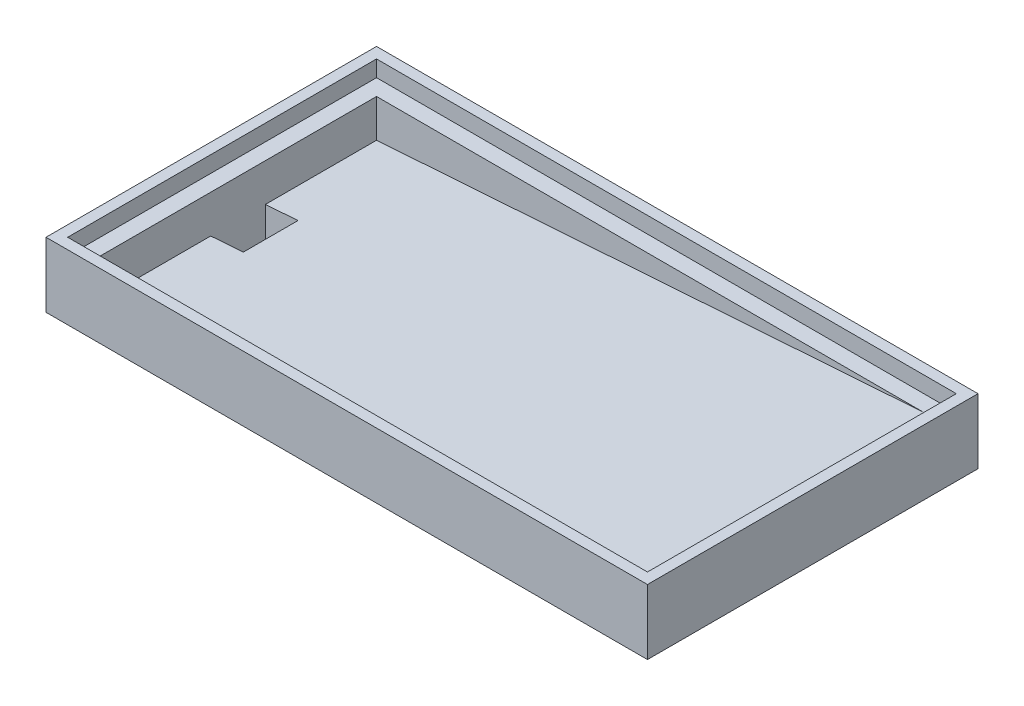
ISO-10303-21;
HEADER;
FILE_DESCRIPTION(('STEP AP214'),'2;1');
FILE_NAME('part.step','',(''),(''),'','','');
FILE_SCHEMA(('AUTOMOTIVE_DESIGN { 1 0 10303 214 1 1 1 1 }'));
ENDSEC;
DATA;
#1=APPLICATION_CONTEXT('core data for automotive mechanical design processes');
#2=APPLICATION_PROTOCOL_DEFINITION('international standard','automotive_design',2000,#1);
#3=PRODUCT_CONTEXT('',#1,'mechanical');
#4=PRODUCT('Part','Part','',(#3));
#5=PRODUCT_RELATED_PRODUCT_CATEGORY('part','',(#4));
#6=PRODUCT_DEFINITION_FORMATION('','',#4);
#7=PRODUCT_DEFINITION_CONTEXT('part definition',#1,'design');
#8=PRODUCT_DEFINITION('design','',#6,#7);
#9=PRODUCT_DEFINITION_SHAPE('','',#8);
#10=(LENGTH_UNIT() NAMED_UNIT(*) SI_UNIT(.MILLI.,.METRE.));
#11=(NAMED_UNIT(*) PLANE_ANGLE_UNIT() SI_UNIT($,.RADIAN.));
#12=(NAMED_UNIT(*) SI_UNIT($,.STERADIAN.) SOLID_ANGLE_UNIT());
#13=UNCERTAINTY_MEASURE_WITH_UNIT(LENGTH_MEASURE(1.E-05),#10,'distance_accuracy_value','');
#14=(GEOMETRIC_REPRESENTATION_CONTEXT(3) GLOBAL_UNCERTAINTY_ASSIGNED_CONTEXT((#13)) GLOBAL_UNIT_ASSIGNED_CONTEXT((#10,
#11,#12)) REPRESENTATION_CONTEXT('',''));
#15=CARTESIAN_POINT('',(0.,0.,0.));
#16=DIRECTION('',(0.,0.,1.));
#17=DIRECTION('',(1.,0.,0.));
#18=AXIS2_PLACEMENT_3D('',#15,#16,#17);
#19=CARTESIAN_POINT('',(0.,-20.,-23.4));
#20=DIRECTION('',(0.,0.,1.));
#21=DIRECTION('',(1.,0.,0.));
#22=AXIS2_PLACEMENT_3D('',#19,#20,#21);
#23=PLANE('',#22);
#24=DIRECTION('',(1.,0.,0.));
#25=VECTOR('',#24,1.);
#26=CARTESIAN_POINT('',(0.,-20.,-23.4));
#27=LINE('',#26,#25);
#28=CARTESIAN_POINT('',(3.00000000000001,-20.,-23.4));
#29=VERTEX_POINT('',#28);
#30=CARTESIAN_POINT('',(27.9998333328704,-20.,-23.4));
#31=VERTEX_POINT('',#30);
#32=EDGE_CURVE('E266',#29,#31,#27,.T.);
#33=ORIENTED_EDGE('',*,*,#32,.F.);
#34=DIRECTION('',(0.,-1.,0.));
#35=VECTOR('',#34,1.);
#36=CARTESIAN_POINT('',(3.00000000000001,-2.,-23.4));
#37=LINE('',#36,#35);
#38=CARTESIAN_POINT('',(2.99999999999999,-10.,-23.4));
#39=VERTEX_POINT('',#38);
#40=EDGE_CURVE('E248',#39,#29,#37,.T.);
#41=ORIENTED_EDGE('',*,*,#40,.F.);
#42=DIRECTION('',(-0.997606892616086,-0.0691410717654713,0.));
#43=VECTOR('',#42,1.);
#44=CARTESIAN_POINT('',(104.,-3.,-23.4));
#45=LINE('',#44,#43);
#46=CARTESIAN_POINT('',(9.00000000000001,-9.58415841584159,-23.4));
#47=VERTEX_POINT('',#46);
#48=EDGE_CURVE('E12',#47,#39,#45,.T.);
#49=ORIENTED_EDGE('',*,*,#48,.F.);
#50=DIRECTION('',(0.,-1.,0.));
#51=VECTOR('',#50,1.);
#52=CARTESIAN_POINT('',(9.00000000000001,-2.,-23.4));
#53=LINE('',#52,#51);
#54=CARTESIAN_POINT('',(9.00000000000001,-12.,-23.4));
#55=VERTEX_POINT('',#54);
#56=EDGE_CURVE('E403',#47,#55,#53,.T.);
#57=ORIENTED_EDGE('',*,*,#56,.T.);
#58=DIRECTION('',(1.,0.,0.));
#59=VECTOR('',#58,1.);
#60=CARTESIAN_POINT('',(0.,-12.,-23.4));
#61=LINE('',#60,#59);
#62=CARTESIAN_POINT('',(27.9998333328704,-12.,-23.4));
#63=VERTEX_POINT('',#62);
#64=EDGE_CURVE('E279',#55,#63,#61,.T.);
#65=ORIENTED_EDGE('',*,*,#64,.T.);
#66=DIRECTION('',(0.,1.,0.));
#67=VECTOR('',#66,1.);
#68=CARTESIAN_POINT('',(27.9998333328704,-20.,-23.4));
#69=LINE('',#68,#67);
#70=EDGE_CURVE('E307',#31,#63,#69,.T.);
#71=ORIENTED_EDGE('',*,*,#70,.F.);
#72=EDGE_LOOP('',(#33,#41,#49,#57,#65,#71));
#73=FACE_BOUND('',#72,.T.);
#74=ADVANCED_FACE('F89',(#73),#23,.F.);
#75=CARTESIAN_POINT('',(0.,-20.,-33.5));
#76=DIRECTION('',(0.,0.,1.));
#77=DIRECTION('',(1.,0.,0.));
#78=AXIS2_PLACEMENT_3D('',#75,#76,#77);
#79=PLANE('',#78);
#80=DIRECTION('',(0.,-1.,0.));
#81=VECTOR('',#80,1.);
#82=CARTESIAN_POINT('',(3.00000000000001,-2.,-33.5));
#83=LINE('',#82,#81);
#84=CARTESIAN_POINT('',(2.99999999999999,-10.,-33.5));
#85=VERTEX_POINT('',#84);
#86=CARTESIAN_POINT('',(3.00000000000001,-20.,-33.5));
#87=VERTEX_POINT('',#86);
#88=EDGE_CURVE('E230',#85,#87,#83,.T.);
#89=ORIENTED_EDGE('',*,*,#88,.T.);
#90=DIRECTION('',(1.,0.,0.));
#91=VECTOR('',#90,1.);
#92=CARTESIAN_POINT('',(0.,-20.,-33.5));
#93=LINE('',#92,#91);
#94=CARTESIAN_POINT('',(27.9998333328704,-20.,-33.5));
#95=VERTEX_POINT('',#94);
#96=EDGE_CURVE('E235',#87,#95,#93,.T.);
#97=ORIENTED_EDGE('',*,*,#96,.T.);
#98=DIRECTION('',(0.,1.,0.));
#99=VECTOR('',#98,1.);
#100=CARTESIAN_POINT('',(27.9998333328704,-20.,-33.5));
#101=LINE('',#100,#99);
#102=CARTESIAN_POINT('',(27.9998333328704,-12.,-33.5));
#103=VERTEX_POINT('',#102);
#104=EDGE_CURVE('E278',#95,#103,#101,.T.);
#105=ORIENTED_EDGE('',*,*,#104,.T.);
#106=DIRECTION('',(1.,0.,0.));
#107=VECTOR('',#106,1.);
#108=CARTESIAN_POINT('',(0.,-12.,-33.5));
#109=LINE('',#108,#107);
#110=CARTESIAN_POINT('',(9.00000000000001,-12.,-33.5));
#111=VERTEX_POINT('',#110);
#112=EDGE_CURVE('E287',#111,#103,#109,.T.);
#113=ORIENTED_EDGE('',*,*,#112,.F.);
#114=DIRECTION('',(0.,-1.,0.));
#115=VECTOR('',#114,1.);
#116=CARTESIAN_POINT('',(9.00000000000001,-2.,-33.5));
#117=LINE('',#116,#115);
#118=CARTESIAN_POINT('',(9.00000000000002,-9.58415841584158,-33.5));
#119=VERTEX_POINT('',#118);
#120=EDGE_CURVE('E105',#119,#111,#117,.T.);
#121=ORIENTED_EDGE('',*,*,#120,.F.);
#122=DIRECTION('',(0.997606892616086,0.0691410717654713,0.));
#123=VECTOR('',#122,1.);
#124=CARTESIAN_POINT('',(104.,-3.,-33.5000000000001));
#125=LINE('',#124,#123);
#126=EDGE_CURVE('E238',#85,#119,#125,.T.);
#127=ORIENTED_EDGE('',*,*,#126,.F.);
#128=EDGE_LOOP('',(#89,#97,#105,#113,#121,#127));
#129=FACE_BOUND('',#128,.T.);
#130=ADVANCED_FACE('F232',(#129),#79,.T.);
#131=CARTESIAN_POINT('',(0.,-12.,0.));
#132=DIRECTION('',(0.,1.,0.));
#133=DIRECTION('',(0.,0.,1.));
#134=AXIS2_PLACEMENT_3D('',#131,#132,#133);
#135=PLANE('',#134);
#136=DIRECTION('',(0.,0.,1.));
#137=VECTOR('',#136,1.);
#138=CARTESIAN_POINT('',(9.00000000000001,-12.,-33.5));
#139=LINE('',#138,#137);
#140=EDGE_CURVE('E242',#111,#55,#139,.T.);
#141=ORIENTED_EDGE('',*,*,#140,.F.);
#142=ORIENTED_EDGE('',*,*,#112,.T.);
#143=DIRECTION('',(0.,0.,-1.));
#144=VECTOR('',#143,1.);
#145=CARTESIAN_POINT('',(27.9998333328704,-12.,0.));
#146=LINE('',#145,#144);
#147=EDGE_CURVE('E282',#63,#103,#146,.T.);
#148=ORIENTED_EDGE('',*,*,#147,.F.);
#149=ORIENTED_EDGE('',*,*,#64,.F.);
#150=EDGE_LOOP('',(#141,#142,#148,#149));
#151=FACE_BOUND('',#150,.T.);
#152=ADVANCED_FACE('F462',(#151),#135,.F.);
#153=CARTESIAN_POINT('',(104.,-20.002,-54.));
#154=DIRECTION('',(0.,0.,-1.));
#155=DIRECTION('',(-1.,0.,0.));
#156=AXIS2_PLACEMENT_3D('',#153,#154,#155);
#157=PLANE('',#156);
#158=DIRECTION('',(0.997606892616086,0.0691410717654713,0.));
#159=VECTOR('',#158,1.);
#160=CARTESIAN_POINT('',(104.,-3.,-54.));
#161=LINE('',#160,#159);
#162=CARTESIAN_POINT('',(3.,-10.,-54.));
#163=VERTEX_POINT('',#162);
#164=CARTESIAN_POINT('',(104.,-3.,-54.));
#165=VERTEX_POINT('',#164);
#166=EDGE_CURVE('E417',#163,#165,#161,.T.);
#167=ORIENTED_EDGE('',*,*,#166,.T.);
#168=DIRECTION('',(-1.,0.,0.));
#169=VECTOR('',#168,1.);
#170=CARTESIAN_POINT('',(104.,-3.,-54.));
#171=LINE('',#170,#169);
#172=CARTESIAN_POINT('',(3.,-3.,-54.));
#173=VERTEX_POINT('',#172);
#174=EDGE_CURVE('E426',#165,#173,#171,.T.);
#175=ORIENTED_EDGE('',*,*,#174,.T.);
#176=DIRECTION('',(0.,1.,0.));
#177=VECTOR('',#176,1.);
#178=CARTESIAN_POINT('',(3.,-20.002,-54.));
#179=LINE('',#178,#177);
#180=EDGE_CURVE('E437',#163,#173,#179,.T.);
#181=ORIENTED_EDGE('',*,*,#180,.F.);
#182=EDGE_LOOP('',(#167,#175,#181));
#183=FACE_BOUND('',#182,.T.);
#184=ADVANCED_FACE('F465',(#183),#157,.F.);
#185=CARTESIAN_POINT('',(3.00000000000001,-20.002,-3.));
#186=DIRECTION('',(0.,0.,1.));
#187=DIRECTION('',(1.,0.,0.));
#188=AXIS2_PLACEMENT_3D('',#185,#186,#187);
#189=PLANE('',#188);
#190=DIRECTION('',(0.997606892616085,0.0691410717654713,0.));
#191=VECTOR('',#190,1.);
#192=CARTESIAN_POINT('',(104.,-3.,-3.00000000000001));
#193=LINE('',#192,#191);
#194=CARTESIAN_POINT('',(3.00000000000001,-10.,-3.));
#195=VERTEX_POINT('',#194);
#196=CARTESIAN_POINT('',(104.,-3.,-3.00000000000001));
#197=VERTEX_POINT('',#196);
#198=EDGE_CURVE('E410',#195,#197,#193,.T.);
#199=ORIENTED_EDGE('',*,*,#198,.F.);
#200=DIRECTION('',(0.,1.,0.));
#201=VECTOR('',#200,1.);
#202=CARTESIAN_POINT('',(3.00000000000001,-20.002,-3.));
#203=LINE('',#202,#201);
#204=CARTESIAN_POINT('',(3.00000000000001,-3.,-3.));
#205=VERTEX_POINT('',#204);
#206=EDGE_CURVE('E448',#195,#205,#203,.T.);
#207=ORIENTED_EDGE('',*,*,#206,.T.);
#208=DIRECTION('',(1.,0.,0.));
#209=VECTOR('',#208,1.);
#210=CARTESIAN_POINT('',(3.00000000000001,-3.,-3.));
#211=LINE('',#210,#209);
#212=EDGE_CURVE('E425',#205,#197,#211,.T.);
#213=ORIENTED_EDGE('',*,*,#212,.T.);
#214=EDGE_LOOP('',(#199,#207,#213));
#215=FACE_BOUND('',#214,.T.);
#216=ADVANCED_FACE('F473',(#215),#189,.F.);
#217=DIRECTION('',(1.,0.,0.));
#218=VECTOR('',#217,1.);
#219=CARTESIAN_POINT('',(0.,-12.,-43.5));
#220=LINE('',#219,#218);
#221=CARTESIAN_POINT('',(-2.00000000000001,-12.,-43.5));
#222=VERTEX_POINT('',#221);
#223=CARTESIAN_POINT('',(37.9998333328704,-12.,-43.5));
#224=VERTEX_POINT('',#223);
#225=EDGE_CURVE('E298',#222,#224,#220,.T.);
#226=ORIENTED_EDGE('',*,*,#225,.F.);
#227=DIRECTION('',(0.,0.,-1.));
#228=VECTOR('',#227,1.);
#229=CARTESIAN_POINT('',(-2.00000000000001,-12.,-59.));
#230=LINE('',#229,#228);
#231=CARTESIAN_POINT('',(-2.00000000000001,-12.,-59.));
#232=VERTEX_POINT('',#231);
#233=EDGE_CURVE('E332',#222,#232,#230,.T.);
#234=ORIENTED_EDGE('',*,*,#233,.T.);
#235=DIRECTION('',(1.,0.,0.));
#236=VECTOR('',#235,1.);
#237=CARTESIAN_POINT('',(109.,-12.,-59.));
#238=LINE('',#237,#236);
#239=CARTESIAN_POINT('',(109.,-12.,-59.));
#240=VERTEX_POINT('',#239);
#241=EDGE_CURVE('E336',#232,#240,#238,.T.);
#242=ORIENTED_EDGE('',*,*,#241,.T.);
#243=DIRECTION('',(0.,0.,1.));
#244=VECTOR('',#243,1.);
#245=CARTESIAN_POINT('',(109.,-12.,2.));
#246=LINE('',#245,#244);
#247=CARTESIAN_POINT('',(109.,-12.,2.));
#248=VERTEX_POINT('',#247);
#249=EDGE_CURVE('E319',#240,#248,#246,.T.);
#250=ORIENTED_EDGE('',*,*,#249,.T.);
#251=DIRECTION('',(-1.,0.,0.));
#252=VECTOR('',#251,1.);
#253=CARTESIAN_POINT('',(-2.,-12.,2.));
#254=LINE('',#253,#252);
#255=CARTESIAN_POINT('',(-2.,-12.,2.));
#256=VERTEX_POINT('',#255);
#257=EDGE_CURVE('E328',#248,#256,#254,.T.);
#258=ORIENTED_EDGE('',*,*,#257,.T.);
#259=CARTESIAN_POINT('',(-2.,-12.,-13.5));
#260=VERTEX_POINT('',#259);
#261=EDGE_CURVE('E333',#256,#260,#230,.T.);
#262=ORIENTED_EDGE('',*,*,#261,.T.);
#263=DIRECTION('',(-1.,0.,0.));
#264=VECTOR('',#263,1.);
#265=CARTESIAN_POINT('',(0.,-12.,-13.5));
#266=LINE('',#265,#264);
#267=CARTESIAN_POINT('',(37.9998333328704,-12.,-13.5));
#268=VERTEX_POINT('',#267);
#269=EDGE_CURVE('E294',#268,#260,#266,.T.);
#270=ORIENTED_EDGE('',*,*,#269,.F.);
#271=DIRECTION('',(0.,0.,1.));
#272=VECTOR('',#271,1.);
#273=CARTESIAN_POINT('',(37.9998333328704,-12.,0.));
#274=LINE('',#273,#272);
#275=EDGE_CURVE('E290',#224,#268,#274,.T.);
#276=ORIENTED_EDGE('',*,*,#275,.F.);
#277=EDGE_LOOP('',(#226,#234,#242,#250,#258,#262,#270,#276));
#278=FACE_BOUND('',#277,.T.);
#279=ADVANCED_FACE('F467',(#278),#135,.F.);
#280=CARTESIAN_POINT('',(-2.,-10.,0.));
#281=DIRECTION('',(-1.,0.,0.));
#282=DIRECTION('',(0.,0.,1.));
#283=AXIS2_PLACEMENT_3D('',#280,#281,#282);
#284=PLANE('',#283);
#285=DIRECTION('',(0.,0.,1.));
#286=VECTOR('',#285,1.);
#287=CARTESIAN_POINT('',(-2.,0.,0.));
#288=LINE('',#287,#286);
#289=CARTESIAN_POINT('',(-2.00000000000001,0.,-59.));
#290=VERTEX_POINT('',#289);
#291=CARTESIAN_POINT('',(-2.,0.,2.));
#292=VERTEX_POINT('',#291);
#293=EDGE_CURVE('E360',#290,#292,#288,.T.);
#294=ORIENTED_EDGE('',*,*,#293,.F.);
#295=DIRECTION('',(0.,1.,0.));
#296=VECTOR('',#295,1.);
#297=CARTESIAN_POINT('',(-2.00000000000001,-10.,-59.));
#298=LINE('',#297,#296);
#299=EDGE_CURVE('E385',#232,#290,#298,.T.);
#300=ORIENTED_EDGE('',*,*,#299,.F.);
#301=ORIENTED_EDGE('',*,*,#233,.F.);
#302=DIRECTION('',(0.,1.,0.));
#303=VECTOR('',#302,1.);
#304=CARTESIAN_POINT('',(-2.00000000000001,-20.,-43.5));
#305=LINE('',#304,#303);
#306=CARTESIAN_POINT('',(-2.00000000000001,-20.,-43.5));
#307=VERTEX_POINT('',#306);
#308=EDGE_CURVE('E306',#307,#222,#305,.T.);
#309=ORIENTED_EDGE('',*,*,#308,.F.);
#310=DIRECTION('',(0.,0.,-1.));
#311=VECTOR('',#310,1.);
#312=CARTESIAN_POINT('',(-2.,-20.,0.));
#313=LINE('',#312,#311);
#314=CARTESIAN_POINT('',(-2.,-20.,-13.5));
#315=VERTEX_POINT('',#314);
#316=EDGE_CURVE('E272',#315,#307,#313,.T.);
#317=ORIENTED_EDGE('',*,*,#316,.F.);
#318=DIRECTION('',(0.,1.,0.));
#319=VECTOR('',#318,1.);
#320=CARTESIAN_POINT('',(-2.,-20.,-13.5));
#321=LINE('',#320,#319);
#322=EDGE_CURVE('E311',#315,#260,#321,.T.);
#323=ORIENTED_EDGE('',*,*,#322,.T.);
#324=ORIENTED_EDGE('',*,*,#261,.F.);
#325=DIRECTION('',(0.,1.,0.));
#326=VECTOR('',#325,1.);
#327=CARTESIAN_POINT('',(-2.,-10.,2.));
#328=LINE('',#327,#326);
#329=EDGE_CURVE('E384',#256,#292,#328,.T.);
#330=ORIENTED_EDGE('',*,*,#329,.T.);
#331=EDGE_LOOP('',(#294,#300,#301,#309,#317,#323,#324,#330));
#332=FACE_BOUND('',#331,.T.);
#333=ADVANCED_FACE('F91',(#332),#284,.T.);
#334=CARTESIAN_POINT('',(0.,-10.,-59.));
#335=DIRECTION('',(0.,0.,-1.));
#336=DIRECTION('',(-1.,0.,0.));
#337=AXIS2_PLACEMENT_3D('',#334,#335,#336);
#338=PLANE('',#337);
#339=DIRECTION('',(-1.,0.,0.));
#340=VECTOR('',#339,1.);
#341=CARTESIAN_POINT('',(0.,0.,-59.));
#342=LINE('',#341,#340);
#343=CARTESIAN_POINT('',(109.,0.,-59.));
#344=VERTEX_POINT('',#343);
#345=EDGE_CURVE('E380',#344,#290,#342,.T.);
#346=ORIENTED_EDGE('',*,*,#345,.F.);
#347=DIRECTION('',(0.,1.,0.));
#348=VECTOR('',#347,1.);
#349=CARTESIAN_POINT('',(109.,-10.,-59.));
#350=LINE('',#349,#348);
#351=EDGE_CURVE('E388',#240,#344,#350,.T.);
#352=ORIENTED_EDGE('',*,*,#351,.F.);
#353=ORIENTED_EDGE('',*,*,#241,.F.);
#354=ORIENTED_EDGE('',*,*,#299,.T.);
#355=EDGE_LOOP('',(#346,#352,#353,#354));
#356=FACE_BOUND('',#355,.T.);
#357=ADVANCED_FACE('F555',(#356),#338,.T.);
#358=CARTESIAN_POINT('',(109.,-10.,0.));
#359=DIRECTION('',(1.,0.,0.));
#360=DIRECTION('',(0.,0.,-1.));
#361=AXIS2_PLACEMENT_3D('',#358,#359,#360);
#362=PLANE('',#361);
#363=DIRECTION('',(0.,0.,-1.));
#364=VECTOR('',#363,1.);
#365=CARTESIAN_POINT('',(109.,0.,0.));
#366=LINE('',#365,#364);
#367=CARTESIAN_POINT('',(109.,0.,2.));
#368=VERTEX_POINT('',#367);
#369=EDGE_CURVE('E376',#368,#344,#366,.T.);
#370=ORIENTED_EDGE('',*,*,#369,.F.);
#371=DIRECTION('',(0.,1.,0.));
#372=VECTOR('',#371,1.);
#373=CARTESIAN_POINT('',(109.,-10.,2.));
#374=LINE('',#373,#372);
#375=EDGE_CURVE('E391',#248,#368,#374,.T.);
#376=ORIENTED_EDGE('',*,*,#375,.F.);
#377=ORIENTED_EDGE('',*,*,#249,.F.);
#378=ORIENTED_EDGE('',*,*,#351,.T.);
#379=EDGE_LOOP('',(#370,#376,#377,#378));
#380=FACE_BOUND('',#379,.T.);
#381=ADVANCED_FACE('F667',(#380),#362,.T.);
#382=CARTESIAN_POINT('',(0.,-10.,2.));
#383=DIRECTION('',(0.,0.,1.));
#384=DIRECTION('',(1.,0.,0.));
#385=AXIS2_PLACEMENT_3D('',#382,#383,#384);
#386=PLANE('',#385);
#387=DIRECTION('',(1.,0.,0.));
#388=VECTOR('',#387,1.);
#389=CARTESIAN_POINT('',(0.,0.,2.));
#390=LINE('',#389,#388);
#391=EDGE_CURVE('E372',#292,#368,#390,.T.);
#392=ORIENTED_EDGE('',*,*,#391,.F.);
#393=ORIENTED_EDGE('',*,*,#329,.F.);
#394=ORIENTED_EDGE('',*,*,#257,.F.);
#395=ORIENTED_EDGE('',*,*,#375,.T.);
#396=EDGE_LOOP('',(#392,#393,#394,#395));
#397=FACE_BOUND('',#396,.T.);
#398=ADVANCED_FACE('F659',(#397),#386,.T.);
#399=CARTESIAN_POINT('',(0.,0.,0.));
#400=DIRECTION('',(0.,1.,0.));
#401=DIRECTION('',(0.,0.,1.));
#402=AXIS2_PLACEMENT_3D('',#399,#400,#401);
#403=PLANE('',#402);
#404=DIRECTION('',(0.,0.,1.));
#405=VECTOR('',#404,1.);
#406=CARTESIAN_POINT('',(0.,0.,0.));
#407=LINE('',#406,#405);
#408=CARTESIAN_POINT('',(0.,0.,-57.));
#409=VERTEX_POINT('',#408);
#410=CARTESIAN_POINT('',(0.,0.,0.));
#411=VERTEX_POINT('',#410);
#412=EDGE_CURVE('E340',#409,#411,#407,.T.);
#413=ORIENTED_EDGE('',*,*,#412,.F.);
#414=DIRECTION('',(-1.,0.,0.));
#415=VECTOR('',#414,1.);
#416=CARTESIAN_POINT('',(0.,0.,-57.));
#417=LINE('',#416,#415);
#418=CARTESIAN_POINT('',(107.,0.,-57.));
#419=VERTEX_POINT('',#418);
#420=EDGE_CURVE('E352',#419,#409,#417,.T.);
#421=ORIENTED_EDGE('',*,*,#420,.F.);
#422=DIRECTION('',(0.,0.,-1.));
#423=VECTOR('',#422,1.);
#424=CARTESIAN_POINT('',(107.,0.,0.));
#425=LINE('',#424,#423);
#426=CARTESIAN_POINT('',(107.,0.,0.));
#427=VERTEX_POINT('',#426);
#428=EDGE_CURVE('E348',#427,#419,#425,.T.);
#429=ORIENTED_EDGE('',*,*,#428,.F.);
#430=DIRECTION('',(1.,0.,0.));
#431=VECTOR('',#430,1.);
#432=CARTESIAN_POINT('',(0.,0.,0.));
#433=LINE('',#432,#431);
#434=EDGE_CURVE('E344',#411,#427,#433,.T.);
#435=ORIENTED_EDGE('',*,*,#434,.F.);
#436=EDGE_LOOP('',(#413,#421,#429,#435));
#437=FACE_BOUND('',#436,.T.);
#438=ORIENTED_EDGE('',*,*,#293,.T.);
#439=ORIENTED_EDGE('',*,*,#391,.T.);
#440=ORIENTED_EDGE('',*,*,#369,.T.);
#441=ORIENTED_EDGE('',*,*,#345,.T.);
#442=EDGE_LOOP('',(#438,#439,#440,#441));
#443=FACE_BOUND('',#442,.T.);
#444=ADVANCED_FACE('F649',(#437,#443),#403,.T.);
#445=CARTESIAN_POINT('',(0.,-10.,0.));
#446=DIRECTION('',(-1.,0.,0.));
#447=DIRECTION('',(0.,0.,1.));
#448=AXIS2_PLACEMENT_3D('',#445,#446,#447);
#449=PLANE('',#448);
#450=DIRECTION('',(0.,1.,0.));
#451=VECTOR('',#450,1.);
#452=CARTESIAN_POINT('',(0.,-10.,0.));
#453=LINE('',#452,#451);
#454=CARTESIAN_POINT('',(0.,-3.,0.));
#455=VERTEX_POINT('',#454);
#456=EDGE_CURVE('E356',#455,#411,#453,.T.);
#457=ORIENTED_EDGE('',*,*,#456,.F.);
#458=DIRECTION('',(0.,0.,1.));
#459=VECTOR('',#458,1.);
#460=CARTESIAN_POINT('',(0.,-3.,-57.));
#461=LINE('',#460,#459);
#462=CARTESIAN_POINT('',(0.,-3.,-57.));
#463=VERTEX_POINT('',#462);
#464=EDGE_CURVE('E433',#463,#455,#461,.T.);
#465=ORIENTED_EDGE('',*,*,#464,.F.);
#466=DIRECTION('',(0.,1.,0.));
#467=VECTOR('',#466,1.);
#468=CARTESIAN_POINT('',(0.,-10.,-57.));
#469=LINE('',#468,#467);
#470=EDGE_CURVE('E357',#463,#409,#469,.T.);
#471=ORIENTED_EDGE('',*,*,#470,.T.);
#472=ORIENTED_EDGE('',*,*,#412,.T.);
#473=EDGE_LOOP('',(#457,#465,#471,#472));
#474=FACE_BOUND('',#473,.T.);
#475=ADVANCED_FACE('F641',(#474),#449,.F.);
#476=CARTESIAN_POINT('',(0.,-10.,-57.));
#477=DIRECTION('',(0.,0.,-1.));
#478=DIRECTION('',(-1.,0.,0.));
#479=AXIS2_PLACEMENT_3D('',#476,#477,#478);
#480=PLANE('',#479);
#481=ORIENTED_EDGE('',*,*,#470,.F.);
#482=DIRECTION('',(-1.,0.,0.));
#483=VECTOR('',#482,1.);
#484=CARTESIAN_POINT('',(107.,-3.,-57.));
#485=LINE('',#484,#483);
#486=CARTESIAN_POINT('',(107.,-3.,-57.));
#487=VERTEX_POINT('',#486);
#488=EDGE_CURVE('E441',#487,#463,#485,.T.);
#489=ORIENTED_EDGE('',*,*,#488,.F.);
#490=DIRECTION('',(0.,1.,0.));
#491=VECTOR('',#490,1.);
#492=CARTESIAN_POINT('',(107.,-10.,-57.));
#493=LINE('',#492,#491);
#494=EDGE_CURVE('E361',#487,#419,#493,.T.);
#495=ORIENTED_EDGE('',*,*,#494,.T.);
#496=ORIENTED_EDGE('',*,*,#420,.T.);
#497=EDGE_LOOP('',(#481,#489,#495,#496));
#498=FACE_BOUND('',#497,.T.);
#499=ADVANCED_FACE('F631',(#498),#480,.F.);
#500=CARTESIAN_POINT('',(107.,-10.,0.));
#501=DIRECTION('',(1.,0.,0.));
#502=DIRECTION('',(0.,0.,-1.));
#503=AXIS2_PLACEMENT_3D('',#500,#501,#502);
#504=PLANE('',#503);
#505=ORIENTED_EDGE('',*,*,#494,.F.);
#506=DIRECTION('',(0.,0.,-1.));
#507=VECTOR('',#506,1.);
#508=CARTESIAN_POINT('',(107.,-3.,0.));
#509=LINE('',#508,#507);
#510=CARTESIAN_POINT('',(107.,-3.,0.));
#511=VERTEX_POINT('',#510);
#512=EDGE_CURVE('E438',#511,#487,#509,.T.);
#513=ORIENTED_EDGE('',*,*,#512,.F.);
#514=DIRECTION('',(0.,1.,0.));
#515=VECTOR('',#514,1.);
#516=CARTESIAN_POINT('',(107.,-10.,0.));
#517=LINE('',#516,#515);
#518=EDGE_CURVE('E364',#511,#427,#517,.T.);
#519=ORIENTED_EDGE('',*,*,#518,.T.);
#520=ORIENTED_EDGE('',*,*,#428,.T.);
#521=EDGE_LOOP('',(#505,#513,#519,#520));
#522=FACE_BOUND('',#521,.T.);
#523=ADVANCED_FACE('F620',(#522),#504,.F.);
#524=CARTESIAN_POINT('',(0.,-10.,0.));
#525=DIRECTION('',(0.,0.,1.));
#526=DIRECTION('',(1.,0.,0.));
#527=AXIS2_PLACEMENT_3D('',#524,#525,#526);
#528=PLANE('',#527);
#529=ORIENTED_EDGE('',*,*,#518,.F.);
#530=DIRECTION('',(1.,0.,0.));
#531=VECTOR('',#530,1.);
#532=CARTESIAN_POINT('',(0.,-3.,0.));
#533=LINE('',#532,#531);
#534=EDGE_CURVE('E421',#455,#511,#533,.T.);
#535=ORIENTED_EDGE('',*,*,#534,.F.);
#536=ORIENTED_EDGE('',*,*,#456,.T.);
#537=ORIENTED_EDGE('',*,*,#434,.T.);
#538=EDGE_LOOP('',(#529,#535,#536,#537));
#539=FACE_BOUND('',#538,.T.);
#540=ADVANCED_FACE('F493',(#539),#528,.F.);
#541=CARTESIAN_POINT('',(37.9998333328704,-20.,0.));
#542=DIRECTION('',(-1.,0.,0.));
#543=DIRECTION('',(0.,0.,1.));
#544=AXIS2_PLACEMENT_3D('',#541,#542,#543);
#545=PLANE('',#544);
#546=ORIENTED_EDGE('',*,*,#275,.T.);
#547=DIRECTION('',(0.,1.,0.));
#548=VECTOR('',#547,1.);
#549=CARTESIAN_POINT('',(37.9998333328704,-20.,-13.5));
#550=LINE('',#549,#548);
#551=CARTESIAN_POINT('',(37.9998333328704,-20.,-13.5));
#552=VERTEX_POINT('',#551);
#553=EDGE_CURVE('E315',#552,#268,#550,.T.);
#554=ORIENTED_EDGE('',*,*,#553,.F.);
#555=DIRECTION('',(0.,0.,1.));
#556=VECTOR('',#555,1.);
#557=CARTESIAN_POINT('',(37.9998333328704,-20.,0.));
#558=LINE('',#557,#556);
#559=CARTESIAN_POINT('',(37.9998333328704,-20.,-43.5));
#560=VERTEX_POINT('',#559);
#561=EDGE_CURVE('E259',#560,#552,#558,.T.);
#562=ORIENTED_EDGE('',*,*,#561,.F.);
#563=DIRECTION('',(0.,1.,0.));
#564=VECTOR('',#563,1.);
#565=CARTESIAN_POINT('',(37.9998333328704,-20.,-43.5));
#566=LINE('',#565,#564);
#567=EDGE_CURVE('E302',#560,#224,#566,.T.);
#568=ORIENTED_EDGE('',*,*,#567,.T.);
#569=EDGE_LOOP('',(#546,#554,#562,#568));
#570=FACE_BOUND('',#569,.T.);
#571=ADVANCED_FACE('F490',(#570),#545,.F.);
#572=CARTESIAN_POINT('',(0.,-20.,-13.5));
#573=DIRECTION('',(0.,0.,-1.));
#574=DIRECTION('',(-1.,0.,0.));
#575=AXIS2_PLACEMENT_3D('',#572,#573,#574);
#576=PLANE('',#575);
#577=ORIENTED_EDGE('',*,*,#269,.T.);
#578=ORIENTED_EDGE('',*,*,#322,.F.);
#579=DIRECTION('',(-1.,0.,0.));
#580=VECTOR('',#579,1.);
#581=CARTESIAN_POINT('',(0.,-20.,-13.5));
#582=LINE('',#581,#580);
#583=EDGE_CURVE('E264',#552,#315,#582,.T.);
#584=ORIENTED_EDGE('',*,*,#583,.F.);
#585=ORIENTED_EDGE('',*,*,#553,.T.);
#586=EDGE_LOOP('',(#577,#578,#584,#585));
#587=FACE_BOUND('',#586,.T.);
#588=ADVANCED_FACE('F488',(#587),#576,.F.);
#589=CARTESIAN_POINT('',(27.9998333328704,-20.,0.));
#590=DIRECTION('',(1.,0.,0.));
#591=DIRECTION('',(0.,0.,-1.));
#592=AXIS2_PLACEMENT_3D('',#589,#590,#591);
#593=PLANE('',#592);
#594=ORIENTED_EDGE('',*,*,#147,.T.);
#595=ORIENTED_EDGE('',*,*,#104,.F.);
#596=DIRECTION('',(0.,0.,-1.));
#597=VECTOR('',#596,1.);
#598=CARTESIAN_POINT('',(27.9998333328704,-20.,0.));
#599=LINE('',#598,#597);
#600=EDGE_CURVE('E256',#31,#95,#599,.T.);
#601=ORIENTED_EDGE('',*,*,#600,.F.);
#602=ORIENTED_EDGE('',*,*,#70,.T.);
#603=EDGE_LOOP('',(#594,#595,#601,#602));
#604=FACE_BOUND('',#603,.T.);
#605=ADVANCED_FACE('F459',(#604),#593,.F.);
#606=CARTESIAN_POINT('',(0.,-20.,-43.5));
#607=DIRECTION('',(0.,0.,1.));
#608=DIRECTION('',(1.,0.,0.));
#609=AXIS2_PLACEMENT_3D('',#606,#607,#608);
#610=PLANE('',#609);
#611=ORIENTED_EDGE('',*,*,#225,.T.);
#612=ORIENTED_EDGE('',*,*,#567,.F.);
#613=DIRECTION('',(1.,0.,0.));
#614=VECTOR('',#613,1.);
#615=CARTESIAN_POINT('',(0.,-20.,-43.5));
#616=LINE('',#615,#614);
#617=EDGE_CURVE('E275',#307,#560,#616,.T.);
#618=ORIENTED_EDGE('',*,*,#617,.F.);
#619=ORIENTED_EDGE('',*,*,#308,.T.);
#620=EDGE_LOOP('',(#611,#612,#618,#619));
#621=FACE_BOUND('',#620,.T.);
#622=ADVANCED_FACE('F487',(#621),#610,.F.);
#623=CARTESIAN_POINT('',(0.,-20.,0.));
#624=DIRECTION('',(0.,-1.,0.));
#625=DIRECTION('',(0.,0.,-1.));
#626=AXIS2_PLACEMENT_3D('',#623,#624,#625);
#627=PLANE('',#626);
#628=ORIENTED_EDGE('',*,*,#96,.F.);
#629=DIRECTION('',(0.,0.,1.));
#630=VECTOR('',#629,1.);
#631=CARTESIAN_POINT('',(3.00000000000001,-20.,-33.5));
#632=LINE('',#631,#630);
#633=EDGE_CURVE('E245',#87,#29,#632,.T.);
#634=ORIENTED_EDGE('',*,*,#633,.T.);
#635=ORIENTED_EDGE('',*,*,#32,.T.);
#636=ORIENTED_EDGE('',*,*,#600,.T.);
#637=EDGE_LOOP('',(#628,#634,#635,#636));
#638=FACE_BOUND('',#637,.T.);
#639=ORIENTED_EDGE('',*,*,#561,.T.);
#640=ORIENTED_EDGE('',*,*,#583,.T.);
#641=ORIENTED_EDGE('',*,*,#316,.T.);
#642=ORIENTED_EDGE('',*,*,#617,.T.);
#643=EDGE_LOOP('',(#639,#640,#641,#642));
#644=FACE_BOUND('',#643,.T.);
#645=ADVANCED_FACE('F253',(#638,#644),#627,.T.);
#646=CARTESIAN_POINT('',(3.,-20.002,-54.));
#647=DIRECTION('',(-1.,0.,0.));
#648=DIRECTION('',(0.,0.,1.));
#649=AXIS2_PLACEMENT_3D('',#646,#647,#648);
#650=PLANE('',#649);
#651=DIRECTION('',(0.,0.,1.));
#652=VECTOR('',#651,1.);
#653=CARTESIAN_POINT('',(3.,-3.,-54.));
#654=LINE('',#653,#652);
#655=EDGE_CURVE('E430',#173,#205,#654,.T.);
#656=ORIENTED_EDGE('',*,*,#655,.T.);
#657=ORIENTED_EDGE('',*,*,#206,.F.);
#658=DIRECTION('',(0.,0.,-1.));
#659=VECTOR('',#658,1.);
#660=CARTESIAN_POINT('',(3.,-10.,-54.));
#661=LINE('',#660,#659);
#662=EDGE_CURVE('E283',#195,#39,#661,.T.);
#663=ORIENTED_EDGE('',*,*,#662,.T.);
#664=ORIENTED_EDGE('',*,*,#40,.T.);
#665=ORIENTED_EDGE('',*,*,#633,.F.);
#666=ORIENTED_EDGE('',*,*,#88,.F.);
#667=EDGE_CURVE('E452',#85,#163,#661,.T.);
#668=ORIENTED_EDGE('',*,*,#667,.T.);
#669=ORIENTED_EDGE('',*,*,#180,.T.);
#670=EDGE_LOOP('',(#656,#657,#663,#664,#665,#666,#668,#669));
#671=FACE_BOUND('',#670,.T.);
#672=ADVANCED_FACE('F246',(#671),#650,.F.);
#673=CARTESIAN_POINT('',(0.,-3.,0.));
#674=DIRECTION('',(0.,1.,0.));
#675=DIRECTION('',(0.,0.,1.));
#676=AXIS2_PLACEMENT_3D('',#673,#674,#675);
#677=PLANE('',#676);
#678=ORIENTED_EDGE('',*,*,#212,.F.);
#679=ORIENTED_EDGE('',*,*,#655,.F.);
#680=ORIENTED_EDGE('',*,*,#174,.F.);
#681=DIRECTION('',(0.,0.,-1.));
#682=VECTOR('',#681,1.);
#683=CARTESIAN_POINT('',(104.,-3.,-3.00000000000001));
#684=LINE('',#683,#682);
#685=EDGE_CURVE('E422',#197,#165,#684,.T.);
#686=ORIENTED_EDGE('',*,*,#685,.F.);
#687=EDGE_LOOP('',(#678,#679,#680,#686));
#688=FACE_BOUND('',#687,.T.);
#689=ORIENTED_EDGE('',*,*,#534,.T.);
#690=ORIENTED_EDGE('',*,*,#512,.T.);
#691=ORIENTED_EDGE('',*,*,#488,.T.);
#692=ORIENTED_EDGE('',*,*,#464,.T.);
#693=EDGE_LOOP('',(#689,#690,#691,#692));
#694=FACE_BOUND('',#693,.T.);
#695=ADVANCED_FACE('F503',(#688,#694),#677,.T.);
#696=CARTESIAN_POINT('',(104.,-3.,-59.002));
#697=DIRECTION('',(0.0691410717654713,-0.997606892616086,0.));
#698=DIRECTION('',(0.997606892616086,0.0691410717654713,0.));
#699=AXIS2_PLACEMENT_3D('',#696,#697,#698);
#700=PLANE('',#699);
#701=DIRECTION('',(0.,0.,1.));
#702=VECTOR('',#701,1.);
#703=CARTESIAN_POINT('',(9.00000000000001,-9.58415841584159,-59.002));
#704=LINE('',#703,#702);
#705=EDGE_CURVE('E98',#119,#47,#704,.T.);
#706=ORIENTED_EDGE('',*,*,#705,.T.);
#707=ORIENTED_EDGE('',*,*,#48,.T.);
#708=ORIENTED_EDGE('',*,*,#662,.F.);
#709=ORIENTED_EDGE('',*,*,#198,.T.);
#710=ORIENTED_EDGE('',*,*,#685,.T.);
#711=ORIENTED_EDGE('',*,*,#166,.F.);
#712=ORIENTED_EDGE('',*,*,#667,.F.);
#713=ORIENTED_EDGE('',*,*,#126,.T.);
#714=EDGE_LOOP('',(#706,#707,#708,#709,#710,#711,#712,#713));
#715=FACE_BOUND('',#714,.T.);
#716=ADVANCED_FACE('F400',(#715),#700,.F.);
#717=CARTESIAN_POINT('',(9.00000000000001,-2.,-33.5));
#718=DIRECTION('',(1.,0.,0.));
#719=DIRECTION('',(0.,0.,-1.));
#720=AXIS2_PLACEMENT_3D('',#717,#718,#719);
#721=PLANE('',#720);
#722=ORIENTED_EDGE('',*,*,#120,.T.);
#723=ORIENTED_EDGE('',*,*,#140,.T.);
#724=ORIENTED_EDGE('',*,*,#56,.F.);
#725=ORIENTED_EDGE('',*,*,#705,.F.);
#726=EDGE_LOOP('',(#722,#723,#724,#725));
#727=FACE_BOUND('',#726,.T.);
#728=ADVANCED_FACE('F402',(#727),#721,.F.);
#729=CLOSED_SHELL('',(#74,#130,#152,#184,#216,#279,#333,#357,#381,#398,#444,#475,#499,#523,#540,
#571,#588,#605,#622,#645,#672,#695,#716,#728));
#730=MANIFOLD_SOLID_BREP('B2',#729);
#731=ADVANCED_BREP_SHAPE_REPRESENTATION('',(#18,#730),#14);
#732=SHAPE_DEFINITION_REPRESENTATION(#9,#731);
ENDSEC;
END-ISO-10303-21;
